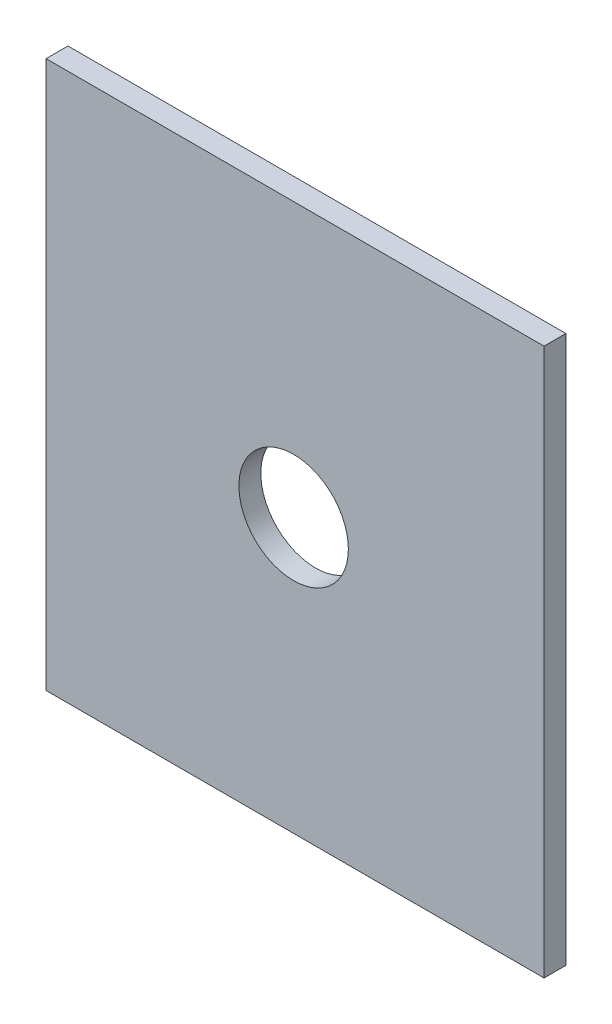
ISO-10303-21;
HEADER;
FILE_DESCRIPTION(('STEP AP214'),'2;1');
FILE_NAME('part.step','',(''),(''),'','','');
FILE_SCHEMA(('AUTOMOTIVE_DESIGN { 1 0 10303 214 1 1 1 1 }'));
ENDSEC;
DATA;
#1=APPLICATION_CONTEXT('core data for automotive mechanical design processes');
#2=APPLICATION_PROTOCOL_DEFINITION('international standard','automotive_design',2000,#1);
#3=PRODUCT_CONTEXT('',#1,'mechanical');
#4=PRODUCT('Part','Part','',(#3));
#5=PRODUCT_RELATED_PRODUCT_CATEGORY('part','',(#4));
#6=PRODUCT_DEFINITION_FORMATION('','',#4);
#7=PRODUCT_DEFINITION_CONTEXT('part definition',#1,'design');
#8=PRODUCT_DEFINITION('design','',#6,#7);
#9=PRODUCT_DEFINITION_SHAPE('','',#8);
#10=(LENGTH_UNIT() NAMED_UNIT(*) SI_UNIT(.MILLI.,.METRE.));
#11=(NAMED_UNIT(*) PLANE_ANGLE_UNIT() SI_UNIT($,.RADIAN.));
#12=(NAMED_UNIT(*) SI_UNIT($,.STERADIAN.) SOLID_ANGLE_UNIT());
#13=UNCERTAINTY_MEASURE_WITH_UNIT(LENGTH_MEASURE(1.E-05),#10,'distance_accuracy_value','');
#14=(GEOMETRIC_REPRESENTATION_CONTEXT(3) GLOBAL_UNCERTAINTY_ASSIGNED_CONTEXT((#13)) GLOBAL_UNIT_ASSIGNED_CONTEXT((#10,
#11,#12)) REPRESENTATION_CONTEXT('',''));
#15=CARTESIAN_POINT('',(0.,0.,0.));
#16=DIRECTION('',(0.,0.,1.));
#17=DIRECTION('',(1.,0.,0.));
#18=AXIS2_PLACEMENT_3D('',#15,#16,#17);
#19=CARTESIAN_POINT('',(0.,0.,4.));
#20=DIRECTION('',(0.,0.,-1.));
#21=DIRECTION('',(-1.,0.,0.));
#22=AXIS2_PLACEMENT_3D('',#19,#20,#21);
#23=PLANE('',#22);
#24=DIRECTION('',(0.,1.,0.));
#25=VECTOR('',#24,1.);
#26=CARTESIAN_POINT('',(35.,-50.,4.));
#27=LINE('',#26,#25);
#28=CARTESIAN_POINT('',(35.,-50.,4.));
#29=VERTEX_POINT('',#28);
#30=CARTESIAN_POINT('',(35.,50.,4.));
#31=VERTEX_POINT('',#30);
#32=EDGE_CURVE('E84',#29,#31,#27,.T.);
#33=ORIENTED_EDGE('',*,*,#32,.T.);
#34=DIRECTION('',(-1.,0.,0.));
#35=VECTOR('',#34,1.);
#36=CARTESIAN_POINT('',(-56.,50.,4.));
#37=LINE('',#36,#35);
#38=CARTESIAN_POINT('',(-56.,50.,4.));
#39=VERTEX_POINT('',#38);
#40=EDGE_CURVE('E79',#31,#39,#37,.T.);
#41=ORIENTED_EDGE('',*,*,#40,.T.);
#42=DIRECTION('',(0.,-1.,0.));
#43=VECTOR('',#42,1.);
#44=CARTESIAN_POINT('',(-56.,-50.,4.));
#45=LINE('',#44,#43);
#46=CARTESIAN_POINT('',(-56.,-50.,4.));
#47=VERTEX_POINT('',#46);
#48=EDGE_CURVE('E82',#39,#47,#45,.T.);
#49=ORIENTED_EDGE('',*,*,#48,.T.);
#50=DIRECTION('',(1.,0.,0.));
#51=VECTOR('',#50,1.);
#52=CARTESIAN_POINT('',(-56.,-50.,4.));
#53=LINE('',#52,#51);
#54=EDGE_CURVE('E49',#47,#29,#53,.T.);
#55=ORIENTED_EDGE('',*,*,#54,.T.);
#56=EDGE_LOOP('',(#33,#41,#49,#55));
#57=FACE_BOUND('',#56,.T.);
#58=CARTESIAN_POINT('',(-10.76,0.,4.));
#59=DIRECTION('',(0.,0.,1.));
#60=DIRECTION('',(1.,0.,0.));
#61=AXIS2_PLACEMENT_3D('',#58,#59,#60);
#62=CIRCLE('',#61,10.);
#63=CARTESIAN_POINT('',(-0.76,0.,4.));
#64=VERTEX_POINT('',#63);
#65=EDGE_CURVE('E99',#64,#64,#62,.T.);
#66=ORIENTED_EDGE('',*,*,#65,.F.);
#67=EDGE_LOOP('',(#66));
#68=FACE_BOUND('',#67,.T.);
#69=ADVANCED_FACE('F32',(#57,#68),#23,.F.);
#70=CARTESIAN_POINT('',(0.,0.,0.));
#71=DIRECTION('',(0.,0.,-1.));
#72=DIRECTION('',(-1.,0.,0.));
#73=AXIS2_PLACEMENT_3D('',#70,#71,#72);
#74=PLANE('',#73);
#75=DIRECTION('',(0.,1.,0.));
#76=VECTOR('',#75,1.);
#77=CARTESIAN_POINT('',(35.,-50.,0.));
#78=LINE('',#77,#76);
#79=CARTESIAN_POINT('',(35.,-50.,0.));
#80=VERTEX_POINT('',#79);
#81=CARTESIAN_POINT('',(35.,50.,0.));
#82=VERTEX_POINT('',#81);
#83=EDGE_CURVE('E96',#80,#82,#78,.T.);
#84=ORIENTED_EDGE('',*,*,#83,.F.);
#85=DIRECTION('',(1.,0.,0.));
#86=VECTOR('',#85,1.);
#87=CARTESIAN_POINT('',(-56.,-50.,0.));
#88=LINE('',#87,#86);
#89=CARTESIAN_POINT('',(-56.,-50.,0.));
#90=VERTEX_POINT('',#89);
#91=EDGE_CURVE('E72',#90,#80,#88,.T.);
#92=ORIENTED_EDGE('',*,*,#91,.F.);
#93=DIRECTION('',(0.,-1.,0.));
#94=VECTOR('',#93,1.);
#95=CARTESIAN_POINT('',(-56.,-50.,0.));
#96=LINE('',#95,#94);
#97=CARTESIAN_POINT('',(-56.,50.,0.));
#98=VERTEX_POINT('',#97);
#99=EDGE_CURVE('E66',#98,#90,#96,.T.);
#100=ORIENTED_EDGE('',*,*,#99,.F.);
#101=DIRECTION('',(-1.,0.,0.));
#102=VECTOR('',#101,1.);
#103=CARTESIAN_POINT('',(-56.,50.,0.));
#104=LINE('',#103,#102);
#105=EDGE_CURVE('E88',#82,#98,#104,.T.);
#106=ORIENTED_EDGE('',*,*,#105,.F.);
#107=EDGE_LOOP('',(#84,#92,#100,#106));
#108=FACE_BOUND('',#107,.T.);
#109=CARTESIAN_POINT('',(-10.76,0.,0.));
#110=DIRECTION('',(0.,0.,1.));
#111=DIRECTION('',(1.,0.,0.));
#112=AXIS2_PLACEMENT_3D('',#109,#110,#111);
#113=CIRCLE('',#112,10.);
#114=CARTESIAN_POINT('',(-0.76,0.,0.));
#115=VERTEX_POINT('',#114);
#116=EDGE_CURVE('E111',#115,#115,#113,.T.);
#117=ORIENTED_EDGE('',*,*,#116,.T.);
#118=EDGE_LOOP('',(#117));
#119=FACE_BOUND('',#118,.T.);
#120=ADVANCED_FACE('F107',(#108,#119),#74,.T.);
#121=CARTESIAN_POINT('',(35.,-50.,4.));
#122=DIRECTION('',(-1.,0.,0.));
#123=DIRECTION('',(0.,0.,1.));
#124=AXIS2_PLACEMENT_3D('',#121,#122,#123);
#125=PLANE('',#124);
#126=ORIENTED_EDGE('',*,*,#83,.T.);
#127=DIRECTION('',(0.,0.,-1.));
#128=VECTOR('',#127,1.);
#129=CARTESIAN_POINT('',(35.,50.,4.));
#130=LINE('',#129,#128);
#131=EDGE_CURVE('E11',#31,#82,#130,.T.);
#132=ORIENTED_EDGE('',*,*,#131,.F.);
#133=ORIENTED_EDGE('',*,*,#32,.F.);
#134=DIRECTION('',(0.,0.,-1.));
#135=VECTOR('',#134,1.);
#136=CARTESIAN_POINT('',(35.,-50.,4.));
#137=LINE('',#136,#135);
#138=EDGE_CURVE('E92',#29,#80,#137,.T.);
#139=ORIENTED_EDGE('',*,*,#138,.T.);
#140=EDGE_LOOP('',(#126,#132,#133,#139));
#141=FACE_BOUND('',#140,.T.);
#142=ADVANCED_FACE('F34',(#141),#125,.F.);
#143=CARTESIAN_POINT('',(-56.,50.,4.));
#144=DIRECTION('',(0.,-1.,0.));
#145=DIRECTION('',(0.,0.,-1.));
#146=AXIS2_PLACEMENT_3D('',#143,#144,#145);
#147=PLANE('',#146);
#148=ORIENTED_EDGE('',*,*,#105,.T.);
#149=DIRECTION('',(0.,0.,-1.));
#150=VECTOR('',#149,1.);
#151=CARTESIAN_POINT('',(-56.,50.,4.));
#152=LINE('',#151,#150);
#153=EDGE_CURVE('E41',#39,#98,#152,.T.);
#154=ORIENTED_EDGE('',*,*,#153,.F.);
#155=ORIENTED_EDGE('',*,*,#40,.F.);
#156=ORIENTED_EDGE('',*,*,#131,.T.);
#157=EDGE_LOOP('',(#148,#154,#155,#156));
#158=FACE_BOUND('',#157,.T.);
#159=ADVANCED_FACE('F87',(#158),#147,.F.);
#160=CARTESIAN_POINT('',(-56.,-50.,4.));
#161=DIRECTION('',(1.,0.,0.));
#162=DIRECTION('',(0.,0.,-1.));
#163=AXIS2_PLACEMENT_3D('',#160,#161,#162);
#164=PLANE('',#163);
#165=ORIENTED_EDGE('',*,*,#99,.T.);
#166=DIRECTION('',(0.,0.,-1.));
#167=VECTOR('',#166,1.);
#168=CARTESIAN_POINT('',(-56.,-50.,4.));
#169=LINE('',#168,#167);
#170=EDGE_CURVE('E89',#47,#90,#169,.T.);
#171=ORIENTED_EDGE('',*,*,#170,.F.);
#172=ORIENTED_EDGE('',*,*,#48,.F.);
#173=ORIENTED_EDGE('',*,*,#153,.T.);
#174=EDGE_LOOP('',(#165,#171,#172,#173));
#175=FACE_BOUND('',#174,.T.);
#176=ADVANCED_FACE('F90',(#175),#164,.F.);
#177=CARTESIAN_POINT('',(-56.,-50.,4.));
#178=DIRECTION('',(0.,1.,0.));
#179=DIRECTION('',(0.,0.,1.));
#180=AXIS2_PLACEMENT_3D('',#177,#178,#179);
#181=PLANE('',#180);
#182=ORIENTED_EDGE('',*,*,#91,.T.);
#183=ORIENTED_EDGE('',*,*,#138,.F.);
#184=ORIENTED_EDGE('',*,*,#54,.F.);
#185=ORIENTED_EDGE('',*,*,#170,.T.);
#186=EDGE_LOOP('',(#182,#183,#184,#185));
#187=FACE_BOUND('',#186,.T.);
#188=ADVANCED_FACE('F104',(#187),#181,.F.);
#189=CARTESIAN_POINT('',(-10.76,0.,4.));
#190=DIRECTION('',(0.,0.,-1.));
#191=DIRECTION('',(-1.,0.,0.));
#192=AXIS2_PLACEMENT_3D('',#189,#190,#191);
#193=CYLINDRICAL_SURFACE('',#192,10.);
#194=ORIENTED_EDGE('',*,*,#65,.T.);
#195=EDGE_LOOP('',(#194));
#196=FACE_BOUND('',#195,.T.);
#197=ORIENTED_EDGE('',*,*,#116,.F.);
#198=EDGE_LOOP('',(#197));
#199=FACE_BOUND('',#198,.T.);
#200=ADVANCED_FACE('F117',(#196,#199),#193,.F.);
#201=CLOSED_SHELL('',(#69,#120,#142,#159,#176,#188,#200));
#202=MANIFOLD_SOLID_BREP('B2',#201);
#203=ADVANCED_BREP_SHAPE_REPRESENTATION('',(#18,#202),#14);
#204=SHAPE_DEFINITION_REPRESENTATION(#9,#203);
ENDSEC;
END-ISO-10303-21;
